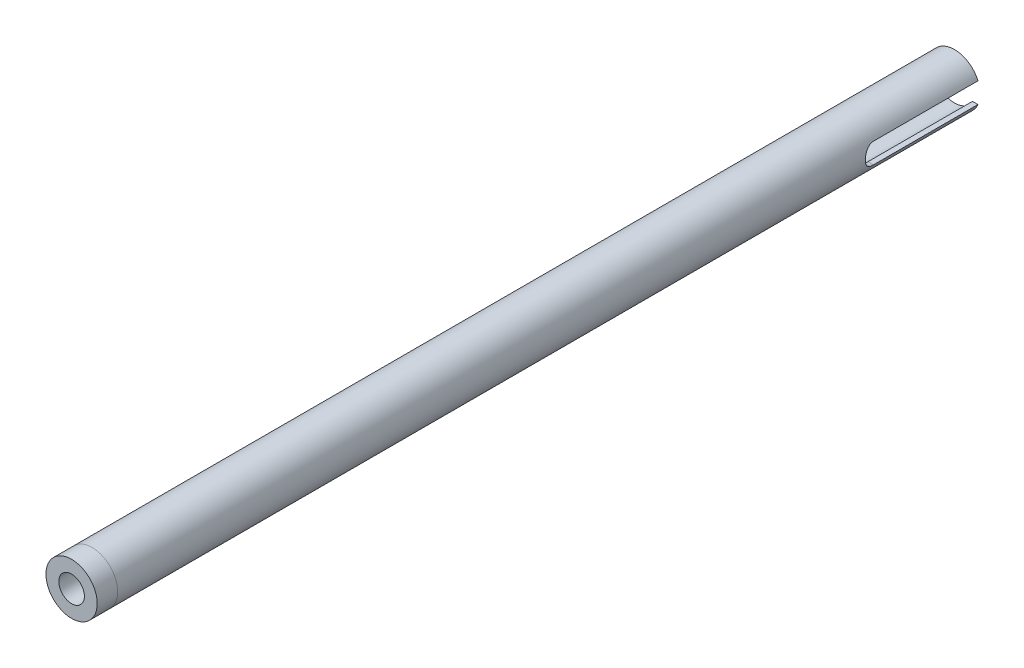
ISO-10303-21;
HEADER;
FILE_DESCRIPTION(('STEP AP214'),'2;1');
FILE_NAME('part.step','',(''),(''),'','','');
FILE_SCHEMA(('AUTOMOTIVE_DESIGN { 1 0 10303 214 1 1 1 1 }'));
ENDSEC;
DATA;
#1=APPLICATION_CONTEXT('core data for automotive mechanical design processes');
#2=APPLICATION_PROTOCOL_DEFINITION('international standard','automotive_design',2000,#1);
#3=PRODUCT_CONTEXT('',#1,'mechanical');
#4=PRODUCT('Part','Part','',(#3));
#5=PRODUCT_RELATED_PRODUCT_CATEGORY('part','',(#4));
#6=PRODUCT_DEFINITION_FORMATION('','',#4);
#7=PRODUCT_DEFINITION_CONTEXT('part definition',#1,'design');
#8=PRODUCT_DEFINITION('design','',#6,#7);
#9=PRODUCT_DEFINITION_SHAPE('','',#8);
#10=(LENGTH_UNIT() NAMED_UNIT(*) SI_UNIT(.MILLI.,.METRE.));
#11=(NAMED_UNIT(*) PLANE_ANGLE_UNIT() SI_UNIT($,.RADIAN.));
#12=(NAMED_UNIT(*) SI_UNIT($,.STERADIAN.) SOLID_ANGLE_UNIT());
#13=UNCERTAINTY_MEASURE_WITH_UNIT(LENGTH_MEASURE(1.E-05),#10,'distance_accuracy_value','');
#14=(GEOMETRIC_REPRESENTATION_CONTEXT(3) GLOBAL_UNCERTAINTY_ASSIGNED_CONTEXT((#13)) GLOBAL_UNIT_ASSIGNED_CONTEXT((#10,
#11,#12)) REPRESENTATION_CONTEXT('',''));
#15=CARTESIAN_POINT('',(0.,0.,0.));
#16=DIRECTION('',(0.,0.,1.));
#17=DIRECTION('',(1.,0.,0.));
#18=AXIS2_PLACEMENT_3D('',#15,#16,#17);
#19=CARTESIAN_POINT('',(0.,0.,-273.485359932267));
#20=DIRECTION('',(0.,0.,1.));
#21=DIRECTION('',(1.,0.,0.));
#22=AXIS2_PLACEMENT_3D('',#19,#20,#21);
#23=CYLINDRICAL_SURFACE('',#22,7.9375);
#24=CARTESIAN_POINT('',(0.,0.,-6.35));
#25=DIRECTION('',(0.,0.,1.));
#26=DIRECTION('',(1.,0.,0.));
#27=AXIS2_PLACEMENT_3D('',#24,#25,#26);
#28=CIRCLE('',#27,7.9375);
#29=CARTESIAN_POINT('',(7.9375,0.,-6.35));
#30=VERTEX_POINT('',#29);
#31=EDGE_CURVE('E167',#30,#30,#28,.T.);
#32=ORIENTED_EDGE('',*,*,#31,.F.);
#33=EDGE_LOOP('',(#32));
#34=FACE_BOUND('',#33,.T.);
#35=CARTESIAN_POINT('',(-7.2748389157424,3.175,-241.100359932267));
#36=CARTESIAN_POINT('',(-7.27482137043434,3.17501267173453,-241.014939816785));
#37=CARTESIAN_POINT('',(-7.27634297592672,3.17155313247793,-240.929529287222));
#38=CARTESIAN_POINT('',(-7.28233338484875,3.15778866907725,-240.759397282894));
#39=CARTESIAN_POINT('',(-7.28680106535325,3.14748635311323,-240.674675558035));
#40=CARTESIAN_POINT('',(-7.29852916312671,3.12019002880163,-240.506861858226));
#41=CARTESIAN_POINT('',(-7.30577831906487,3.10322299732752,-240.423764713467));
#42=CARTESIAN_POINT('',(-7.32282161153745,3.06278779397034,-240.259453611441));
#43=CARTESIAN_POINT('',(-7.33261590324725,3.03931922568673,-240.178239769328));
#44=CARTESIAN_POINT('',(-7.36535331460444,2.9595292434296,-239.938414946745));
#45=CARTESIAN_POINT('',(-7.3916759567784,2.89376893609236,-239.783290017942));
#46=CARTESIAN_POINT('',(-7.45033259991548,2.73920602658921,-239.48620259123));
#47=CARTESIAN_POINT('',(-7.48267254395243,2.65038060922871,-239.344253316013));
#48=CARTESIAN_POINT('',(-7.55175295441386,2.44684429809695,-239.069532546493));
#49=CARTESIAN_POINT('',(-7.58863404630154,2.33103943595689,-238.937605161981));
#50=CARTESIAN_POINT('',(-7.66147718953598,2.07914562663536,-238.694442278349));
#51=CARTESIAN_POINT('',(-7.69743902899202,1.94305205135847,-238.583211513422));
#52=CARTESIAN_POINT('',(-7.76611692840652,1.64778282664418,-238.380290313926));
#53=CARTESIAN_POINT('',(-7.79864638434713,1.48790317306355,-238.289555902522));
#54=CARTESIAN_POINT('',(-7.85502980346525,1.15369615984562,-238.136698349105));
#55=CARTESIAN_POINT('',(-7.87889360585224,0.979385463602713,-238.074542736487));
#56=CARTESIAN_POINT('',(-7.91022225039827,0.670405323433344,-237.994031092831));
#57=CARTESIAN_POINT('',(-7.92038443902171,0.537888188660429,-237.968353169422));
#58=CARTESIAN_POINT('',(-7.93061686811603,0.337231082382099,-237.94259808634));
#59=CARTESIAN_POINT('',(-7.93319257341971,0.269991647180292,-237.93613998906));
#60=CARTESIAN_POINT('',(-7.93663621925193,0.135173873369592,-237.927518971308));
#61=CARTESIAN_POINT('',(-7.93750363389236,0.067595436817584,-237.92535737349));
#62=CARTESIAN_POINT('',(-7.9375,0.,-237.925359932267));
#63=B_SPLINE_CURVE_WITH_KNOTS('',3,(#35,#36,#37,#38,#39,#40,#41,#42,#43,#44,#45,#46,#47,#48,#49,
#50,#51,#52,#53,#54,#55,#56,#57,#58,#59,#60,#61,#62),.UNSPECIFIED.,.F.,.F.,(4,2,2,2,2,2,2,2,2,2,
2,2,2,4),(0.,0.25616079739664,0.512224013007086,0.767261264672294,1.02231406945474,
1.53142416248601,2.041039780479,2.57679273649399,3.11266809162684,3.66991136029743,
4.22651992730647,4.63134321412667,4.83399375866621,5.03670667834028),.UNSPECIFIED.);
#64=CARTESIAN_POINT('',(-7.2748389157424,3.175,-241.100359932267));
#65=VERTEX_POINT('',#64);
#66=CARTESIAN_POINT('',(-7.9375,0.,-237.925359932267));
#67=VERTEX_POINT('',#66);
#68=EDGE_CURVE('E194',#65,#67,#63,.T.);
#69=ORIENTED_EDGE('',*,*,#68,.T.);
#70=CARTESIAN_POINT('',(-7.9375,0.,-237.925359932267));
#71=CARTESIAN_POINT('',(-7.93751279435796,-0.0856973243893161,-237.925347902098));
#72=CARTESIAN_POINT('',(-7.93611246860092,-0.171386675169289,-237.92882926957));
#73=CARTESIAN_POINT('',(-7.93058107051394,-0.342092796869087,-237.942685364905));
#74=CARTESIAN_POINT('',(-7.92645080745519,-0.427109759557717,-237.953058049888));
#75=CARTESIAN_POINT('',(-7.91557399086504,-0.595570690948318,-237.980555243955));
#76=CARTESIAN_POINT('',(-7.90883664469869,-0.679019123580009,-237.997655995228));
#77=CARTESIAN_POINT('',(-7.89293284658536,-0.844038966454647,-238.038423242702));
#78=CARTESIAN_POINT('',(-7.88376629739099,-0.925610301410308,-238.062090001758));
#79=CARTESIAN_POINT('',(-7.8529700783248,-1.16656173687589,-238.142597657457));
#80=CARTESIAN_POINT('',(-7.82802544143957,-1.32244720282991,-238.208990290334));
#81=CARTESIAN_POINT('',(-7.77174407779742,-1.6208190257289,-238.365035694327));
#82=CARTESIAN_POINT('',(-7.74040257287306,-1.76329524966532,-238.45470586639));
#83=CARTESIAN_POINT('',(-7.67287736621953,-2.03755465224645,-238.659159473905));
#84=CARTESIAN_POINT('',(-7.63654472176442,-2.16862853615059,-238.774846330637));
#85=CARTESIAN_POINT('',(-7.56380976030912,-2.41011022612819,-239.026140432346));
#86=CARTESIAN_POINT('',(-7.52740741976911,-2.52050895891189,-239.161756376828));
#87=CARTESIAN_POINT('',(-7.45683282624283,-2.72240939900243,-239.456454871695));
#88=CARTESIAN_POINT('',(-7.4228346735038,-2.81283701743191,-239.61631886161));
#89=CARTESIAN_POINT('',(-7.36333622196319,-2.96511894168389,-239.950444826406));
#90=CARTESIAN_POINT('',(-7.33782422493328,-3.02701262758154,-240.124686564166));
#91=CARTESIAN_POINT('',(-7.30424985403508,-3.10695047193343,-240.432990288817));
#92=CARTESIAN_POINT('',(-7.29331360019112,-3.13238569878911,-240.564849049703));
#93=CARTESIAN_POINT('',(-7.2822797767429,-3.15790858319002,-240.764565931397));
#94=CARTESIAN_POINT('',(-7.27949685702346,-3.16431127275807,-240.831514222157));
#95=CARTESIAN_POINT('',(-7.27577355567174,-3.17285909036155,-240.965755780023));
#96=CARTESIAN_POINT('',(-7.27483380475762,-3.1750027609968,-241.033049157321));
#97=CARTESIAN_POINT('',(-7.2748389157424,-3.175,-241.100359932267));
#98=B_SPLINE_CURVE_WITH_KNOTS('',3,(#70,#71,#72,#73,#74,#75,#76,#77,#78,#79,#80,#81,#82,#83,#84,
#85,#86,#87,#88,#89,#90,#91,#92,#93,#94,#95,#96,#97),.UNSPECIFIED.,.F.,.F.,(4,2,2,2,2,2,2,2,2,2,
2,2,2,4),(0.,0.256996432008006,0.513916713336977,0.769937797705395,1.02596913282158,
1.53722547809955,2.04886511530061,2.58219314099272,3.115754672018,3.67332953074262,
4.23013255190376,4.63306130520188,4.83485003827449,5.03670780985621),.UNSPECIFIED.);
#99=CARTESIAN_POINT('',(-7.2748389157424,-3.175,-241.100359932267));
#100=VERTEX_POINT('',#99);
#101=EDGE_CURVE('E146',#67,#100,#98,.T.);
#102=ORIENTED_EDGE('',*,*,#101,.T.);
#103=DIRECTION('',(0.,0.,-1.));
#104=VECTOR('',#103,1.);
#105=CARTESIAN_POINT('',(-7.2748389157424,-3.175,-237.925359932267));
#106=LINE('',#105,#104);
#107=CARTESIAN_POINT('',(-7.2748389157424,-3.175,-273.485359932267));
#108=VERTEX_POINT('',#107);
#109=EDGE_CURVE('E141',#100,#108,#106,.T.);
#110=ORIENTED_EDGE('',*,*,#109,.T.);
#111=CARTESIAN_POINT('',(0.,0.,-273.485359932267));
#112=DIRECTION('',(0.,0.,1.));
#113=DIRECTION('',(1.,0.,0.));
#114=AXIS2_PLACEMENT_3D('',#111,#112,#113);
#115=CIRCLE('',#114,7.9375);
#116=CARTESIAN_POINT('',(7.2748389157424,-3.175,-273.485359932267));
#117=VERTEX_POINT('',#116);
#118=EDGE_CURVE('E144',#108,#117,#115,.T.);
#119=ORIENTED_EDGE('',*,*,#118,.T.);
#120=DIRECTION('',(0.,0.,-1.));
#121=VECTOR('',#120,1.);
#122=CARTESIAN_POINT('',(7.2748389157424,-3.175,-237.925359932267));
#123=LINE('',#122,#121);
#124=CARTESIAN_POINT('',(7.2748389157424,-3.175,-241.100359932267));
#125=VERTEX_POINT('',#124);
#126=EDGE_CURVE('E427',#125,#117,#123,.T.);
#127=ORIENTED_EDGE('',*,*,#126,.F.);
#128=CARTESIAN_POINT('',(7.2748389157424,-3.175,-241.100359932267));
#129=CARTESIAN_POINT('',(7.27482137043434,-3.17501267173453,-241.014939816785));
#130=CARTESIAN_POINT('',(7.27634297592672,-3.17155313247793,-240.929529287222));
#131=CARTESIAN_POINT('',(7.28233338484875,-3.15778866907725,-240.759397282894));
#132=CARTESIAN_POINT('',(7.28680106535325,-3.14748635311323,-240.674675558035));
#133=CARTESIAN_POINT('',(7.29852916312671,-3.12019002880163,-240.506861858226));
#134=CARTESIAN_POINT('',(7.30577831906487,-3.10322299732752,-240.423764713467));
#135=CARTESIAN_POINT('',(7.32282161153745,-3.06278779397034,-240.259453611441));
#136=CARTESIAN_POINT('',(7.33261590324725,-3.03931922568673,-240.178239769328));
#137=CARTESIAN_POINT('',(7.36535331460444,-2.9595292434296,-239.938414946745));
#138=CARTESIAN_POINT('',(7.3916759567784,-2.89376893609236,-239.783290017942));
#139=CARTESIAN_POINT('',(7.45033259991548,-2.73920602658921,-239.48620259123));
#140=CARTESIAN_POINT('',(7.48267254395243,-2.65038060922871,-239.344253316013));
#141=CARTESIAN_POINT('',(7.55175295441386,-2.44684429809695,-239.069532546493));
#142=CARTESIAN_POINT('',(7.58863404630154,-2.33103943595689,-238.937605161981));
#143=CARTESIAN_POINT('',(7.66147718953598,-2.07914562663536,-238.694442278349));
#144=CARTESIAN_POINT('',(7.69743902899202,-1.94305205135847,-238.583211513422));
#145=CARTESIAN_POINT('',(7.76611692840652,-1.64778282664418,-238.380290313926));
#146=CARTESIAN_POINT('',(7.79864638434713,-1.48790317306355,-238.289555902522));
#147=CARTESIAN_POINT('',(7.85502980346525,-1.15369615984562,-238.136698349105));
#148=CARTESIAN_POINT('',(7.87889360585224,-0.979385463602713,-238.074542736487));
#149=CARTESIAN_POINT('',(7.91022225039827,-0.670405323433344,-237.994031092831));
#150=CARTESIAN_POINT('',(7.92038443902171,-0.537888188660429,-237.968353169422));
#151=CARTESIAN_POINT('',(7.93061686811603,-0.337231082382099,-237.94259808634));
#152=CARTESIAN_POINT('',(7.93319257341971,-0.269991647180292,-237.93613998906));
#153=CARTESIAN_POINT('',(7.93663621925193,-0.135173873369592,-237.927518971308));
#154=CARTESIAN_POINT('',(7.93750363389236,-0.067595436817584,-237.92535737349));
#155=CARTESIAN_POINT('',(7.9375,0.,-237.925359932267));
#156=B_SPLINE_CURVE_WITH_KNOTS('',3,(#128,#129,#130,#131,#132,#133,#134,#135,#136,#137,#138,
#139,#140,#141,#142,#143,#144,#145,#146,#147,#148,#149,#150,#151,#152,#153,#154,#155),
.UNSPECIFIED.,.F.,.F.,(4,2,2,2,2,2,2,2,2,2,2,2,2,4),(0.,0.25616079739664,0.512224013007086,
0.767261264672294,1.02231406945474,1.53142416248601,2.041039780479,2.57679273649399,
3.11266809162684,3.66991136029743,4.22651992730647,4.63134321412667,4.83399375866621,
5.03670667834028),.UNSPECIFIED.);
#157=CARTESIAN_POINT('',(7.9375,0.,-237.925359932267));
#158=VERTEX_POINT('',#157);
#159=EDGE_CURVE('E87',#125,#158,#156,.T.);
#160=ORIENTED_EDGE('',*,*,#159,.T.);
#161=CARTESIAN_POINT('',(7.9375,0.,-237.925359932267));
#162=CARTESIAN_POINT('',(7.93751279435796,0.0856973243893161,-237.925347902098));
#163=CARTESIAN_POINT('',(7.93611246860092,0.171386675169289,-237.92882926957));
#164=CARTESIAN_POINT('',(7.93058107051394,0.342092796869087,-237.942685364905));
#165=CARTESIAN_POINT('',(7.92645080745519,0.427109759557717,-237.953058049888));
#166=CARTESIAN_POINT('',(7.91557399086504,0.595570690948318,-237.980555243955));
#167=CARTESIAN_POINT('',(7.90883664469869,0.679019123580009,-237.997655995228));
#168=CARTESIAN_POINT('',(7.89293284658536,0.844038966454647,-238.038423242702));
#169=CARTESIAN_POINT('',(7.88376629739099,0.925610301410308,-238.062090001758));
#170=CARTESIAN_POINT('',(7.8529700783248,1.16656173687589,-238.142597657457));
#171=CARTESIAN_POINT('',(7.82802544143957,1.32244720282991,-238.208990290334));
#172=CARTESIAN_POINT('',(7.77174407779742,1.6208190257289,-238.365035694327));
#173=CARTESIAN_POINT('',(7.74040257287306,1.76329524966532,-238.45470586639));
#174=CARTESIAN_POINT('',(7.67287736621953,2.03755465224645,-238.659159473905));
#175=CARTESIAN_POINT('',(7.63654472176442,2.16862853615059,-238.774846330637));
#176=CARTESIAN_POINT('',(7.56380976030912,2.41011022612819,-239.026140432346));
#177=CARTESIAN_POINT('',(7.52740741976911,2.52050895891189,-239.161756376828));
#178=CARTESIAN_POINT('',(7.45683282624283,2.72240939900243,-239.456454871695));
#179=CARTESIAN_POINT('',(7.4228346735038,2.81283701743191,-239.61631886161));
#180=CARTESIAN_POINT('',(7.36333622196319,2.96511894168389,-239.950444826406));
#181=CARTESIAN_POINT('',(7.33782422493328,3.02701262758154,-240.124686564166));
#182=CARTESIAN_POINT('',(7.30424985403508,3.10695047193343,-240.432990288817));
#183=CARTESIAN_POINT('',(7.29331360019112,3.13238569878911,-240.564849049703));
#184=CARTESIAN_POINT('',(7.2822797767429,3.15790858319002,-240.764565931397));
#185=CARTESIAN_POINT('',(7.27949685702346,3.16431127275807,-240.831514222157));
#186=CARTESIAN_POINT('',(7.27577355567174,3.17285909036155,-240.965755780023));
#187=CARTESIAN_POINT('',(7.27483380475762,3.1750027609968,-241.033049157321));
#188=CARTESIAN_POINT('',(7.2748389157424,3.175,-241.100359932267));
#189=B_SPLINE_CURVE_WITH_KNOTS('',3,(#161,#162,#163,#164,#165,#166,#167,#168,#169,#170,#171,
#172,#173,#174,#175,#176,#177,#178,#179,#180,#181,#182,#183,#184,#185,#186,#187,#188),
.UNSPECIFIED.,.F.,.F.,(4,2,2,2,2,2,2,2,2,2,2,2,2,4),(0.,0.256996432008006,0.513916713336977,
0.769937797705395,1.02596913282158,1.53722547809955,2.04886511530061,2.58219314099272,
3.115754672018,3.67332953074262,4.23013255190376,4.63306130520188,4.83485003827449,
5.03670780985621),.UNSPECIFIED.);
#190=CARTESIAN_POINT('',(7.2748389157424,3.175,-241.100359932267));
#191=VERTEX_POINT('',#190);
#192=EDGE_CURVE('E73',#158,#191,#189,.T.);
#193=ORIENTED_EDGE('',*,*,#192,.T.);
#194=DIRECTION('',(0.,0.,-1.));
#195=VECTOR('',#194,1.);
#196=CARTESIAN_POINT('',(7.2748389157424,3.175,-237.925359932267));
#197=LINE('',#196,#195);
#198=CARTESIAN_POINT('',(7.2748389157424,3.175,-273.485359932267));
#199=VERTEX_POINT('',#198);
#200=EDGE_CURVE('E160',#191,#199,#197,.T.);
#201=ORIENTED_EDGE('',*,*,#200,.T.);
#202=CARTESIAN_POINT('',(-7.2748389157424,3.175,-273.485359932267));
#203=VERTEX_POINT('',#202);
#204=EDGE_CURVE('E166',#199,#203,#115,.T.);
#205=ORIENTED_EDGE('',*,*,#204,.T.);
#206=DIRECTION('',(0.,0.,-1.));
#207=VECTOR('',#206,1.);
#208=CARTESIAN_POINT('',(-7.2748389157424,3.175,-237.925359932267));
#209=LINE('',#208,#207);
#210=EDGE_CURVE('E420',#65,#203,#209,.T.);
#211=ORIENTED_EDGE('',*,*,#210,.F.);
#212=EDGE_LOOP('',(#69,#102,#110,#119,#127,#160,#193,#201,#205,#211));
#213=FACE_BOUND('',#212,.T.);
#214=ADVANCED_FACE('F63',(#34,#213),#23,.T.);
#215=CARTESIAN_POINT('',(0.,0.,-273.485359932267));
#216=DIRECTION('',(0.,0.,1.));
#217=DIRECTION('',(1.,0.,0.));
#218=AXIS2_PLACEMENT_3D('',#215,#216,#217);
#219=PLANE('',#218);
#220=DIRECTION('',(1.,0.,0.));
#221=VECTOR('',#220,1.);
#222=CARTESIAN_POINT('',(0.,-3.175,-273.485359932267));
#223=LINE('',#222,#221);
#224=CARTESIAN_POINT('',(-5.57246419907746,-3.175,-273.485359932267));
#225=VERTEX_POINT('',#224);
#226=EDGE_CURVE('E153',#108,#225,#223,.T.);
#227=ORIENTED_EDGE('',*,*,#226,.T.);
#228=CARTESIAN_POINT('',(0.,0.,-273.485359932267));
#229=DIRECTION('',(0.,0.,1.));
#230=DIRECTION('',(1.,0.,0.));
#231=AXIS2_PLACEMENT_3D('',#228,#229,#230);
#232=CIRCLE('',#231,6.4135);
#233=CARTESIAN_POINT('',(5.57246419907746,-3.175,-273.485359932267));
#234=VERTEX_POINT('',#233);
#235=EDGE_CURVE('E275',#225,#234,#232,.T.);
#236=ORIENTED_EDGE('',*,*,#235,.T.);
#237=DIRECTION('',(1.,0.,0.));
#238=VECTOR('',#237,1.);
#239=CARTESIAN_POINT('',(0.,-3.175,-273.485359932267));
#240=LINE('',#239,#238);
#241=EDGE_CURVE('E165',#234,#117,#240,.T.);
#242=ORIENTED_EDGE('',*,*,#241,.T.);
#243=ORIENTED_EDGE('',*,*,#118,.F.);
#244=EDGE_LOOP('',(#227,#236,#242,#243));
#245=FACE_BOUND('',#244,.T.);
#246=ADVANCED_FACE('F163',(#245),#219,.F.);
#247=CARTESIAN_POINT('',(0.,0.,-273.485359932267));
#248=DIRECTION('',(0.,0.,1.));
#249=DIRECTION('',(1.,0.,0.));
#250=AXIS2_PLACEMENT_3D('',#247,#248,#249);
#251=CYLINDRICAL_SURFACE('',#250,6.4135);
#252=CARTESIAN_POINT('',(0.,0.,-6.35));
#253=DIRECTION('',(0.,0.,1.));
#254=DIRECTION('',(1.,0.,0.));
#255=AXIS2_PLACEMENT_3D('',#252,#253,#254);
#256=CIRCLE('',#255,6.4135);
#257=CARTESIAN_POINT('',(6.4135,0.,-6.35));
#258=VERTEX_POINT('',#257);
#259=EDGE_CURVE('E149',#258,#258,#256,.T.);
#260=ORIENTED_EDGE('',*,*,#259,.T.);
#261=EDGE_LOOP('',(#260));
#262=FACE_BOUND('',#261,.T.);
#263=DIRECTION('',(0.,0.,-1.));
#264=VECTOR('',#263,1.);
#265=CARTESIAN_POINT('',(-5.57246419907746,-3.175,-237.925359932267));
#266=LINE('',#265,#264);
#267=CARTESIAN_POINT('',(-5.57246419907746,-3.175,-241.100359932267));
#268=VERTEX_POINT('',#267);
#269=EDGE_CURVE('E150',#268,#225,#266,.T.);
#270=ORIENTED_EDGE('',*,*,#269,.F.);
#271=CARTESIAN_POINT('',(-5.57246419907746,-3.175,-241.100359932267));
#272=CARTESIAN_POINT('',(-5.57244013006406,-3.17501485930532,-241.017080819229));
#273=CARTESIAN_POINT('',(-5.57433046393328,-3.17172393593587,-240.933815052358));
#274=CARTESIAN_POINT('',(-5.58175879139227,-3.1586474174694,-240.768007467546));
#275=CARTESIAN_POINT('',(-5.58729459414878,-3.14886572313218,-240.685465244945));
#276=CARTESIAN_POINT('',(-5.60179156831921,-3.12299843383606,-240.522168438216));
#277=CARTESIAN_POINT('',(-5.61073298145,-3.10694918790095,-240.441406333302));
#278=CARTESIAN_POINT('',(-5.63171276239417,-3.068756659135,-240.281762417801));
#279=CARTESIAN_POINT('',(-5.64375147558632,-3.04661269666536,-240.202880817981));
#280=CARTESIAN_POINT('',(-5.6838799338154,-2.97148657354666,-239.970147642983));
#281=CARTESIAN_POINT('',(-5.71602843451585,-2.9097324304215,-239.819727145744));
#282=CARTESIAN_POINT('',(-5.78746445334563,-2.76491119647658,-239.531269928916));
#283=CARTESIAN_POINT('',(-5.82676307252431,-2.68181088046088,-239.39325297155));
#284=CARTESIAN_POINT('',(-5.91189137020973,-2.48887418737119,-239.121455887522));
#285=CARTESIAN_POINT('',(-5.95799203211626,-2.37743022169017,-238.98889908507));
#286=CARTESIAN_POINT('',(-6.04933625068999,-2.13433179626949,-238.743431415997));
#287=CARTESIAN_POINT('',(-6.09457954365872,-2.00267122837296,-238.630526508985));
#288=CARTESIAN_POINT('',(-6.18270630442022,-1.71220053093682,-238.420207216532));
#289=CARTESIAN_POINT('',(-6.22523407848511,-1.55216870534976,-238.324317466101));
#290=CARTESIAN_POINT('',(-6.29953728626817,-1.21586879246633,-238.161468569784));
#291=CARTESIAN_POINT('',(-6.33132906884324,-1.03962591706377,-238.094465391741));
#292=CARTESIAN_POINT('',(-6.37455801221378,-0.71941894247625,-238.004593559411));
#293=CARTESIAN_POINT('',(-6.38903678436651,-0.577736145507954,-237.975020845046));
#294=CARTESIAN_POINT('',(-6.40364692368403,-0.362616983152033,-237.945299770732));
#295=CARTESIAN_POINT('',(-6.40733246196224,-0.290370591494073,-237.937832258094));
#296=CARTESIAN_POINT('',(-6.41226237468065,-0.145424356491902,-237.927859369156));
#297=CARTESIAN_POINT('',(-6.41350576158006,-0.0727243416303689,-237.925356000219));
#298=CARTESIAN_POINT('',(-6.4135,0.,-237.925359932267));
#299=B_SPLINE_CURVE_WITH_KNOTS('',3,(#271,#272,#273,#274,#275,#276,#277,#278,#279,#280,#281,
#282,#283,#284,#285,#286,#287,#288,#289,#290,#291,#292,#293,#294,#295,#296,#297,#298),
.UNSPECIFIED.,.F.,.F.,(4,2,2,2,2,2,2,2,2,2,2,2,2,4),(0.,0.249729002226581,0.499308060527553,
0.74746066754666,0.995640957972498,1.49055300136661,1.98624009021396,2.52160227908799,
3.05712653941521,3.62817923327588,4.19835836008503,4.63305000595098,4.85103401853339,
5.06910615989469),.UNSPECIFIED.);
#300=CARTESIAN_POINT('',(-6.4135,0.,-237.925359932267));
#301=VERTEX_POINT('',#300);
#302=EDGE_CURVE('E221',#268,#301,#299,.T.);
#303=ORIENTED_EDGE('',*,*,#302,.T.);
#304=CARTESIAN_POINT('',(-6.4135,0.,-237.925359932267));
#305=CARTESIAN_POINT('',(-6.41351478956106,0.0839162873638164,-237.925346532371));
#306=CARTESIAN_POINT('',(-6.41185341043851,0.167823114288179,-237.928686458418));
#307=CARTESIAN_POINT('',(-6.40528923860734,0.334952536326369,-237.941968899023));
#308=CARTESIAN_POINT('',(-6.40038773102953,0.418175389480092,-237.951908795844));
#309=CARTESIAN_POINT('',(-6.38748331817869,0.582965498785221,-237.978227600362));
#310=CARTESIAN_POINT('',(-6.37949454331383,0.664538541389254,-237.99457717585));
#311=CARTESIAN_POINT('',(-6.36062930478242,0.825821595252371,-238.033515479443));
#312=CARTESIAN_POINT('',(-6.34975266552956,0.905531492908815,-238.056104586924));
#313=CARTESIAN_POINT('',(-6.31319792977547,1.14087800407252,-238.132841149684));
#314=CARTESIAN_POINT('',(-6.28356695572382,1.29306927815056,-238.196012797872));
#315=CARTESIAN_POINT('',(-6.216480326228,1.58455945770356,-238.344163539852));
#316=CARTESIAN_POINT('',(-6.17901685649498,1.72384528592311,-238.429164431631));
#317=CARTESIAN_POINT('',(-6.09713913910646,1.99475482128858,-238.624264569883));
#318=CARTESIAN_POINT('',(-6.05244508581476,2.12544046453043,-238.735549446621));
#319=CARTESIAN_POINT('',(-5.96206469267669,2.3671627718888,-238.977518892786));
#320=CARTESIAN_POINT('',(-5.9163776032387,2.47818397002904,-239.108218584626));
#321=CARTESIAN_POINT('',(-5.82517699615971,2.68591268931948,-239.397264413578));
#322=CARTESIAN_POINT('',(-5.77994318763785,2.78087960507694,-239.556959608158));
#323=CARTESIAN_POINT('',(-5.69959190124919,2.94207442790849,-239.89234288534));
#324=CARTESIAN_POINT('',(-5.66445328320705,3.00836254036258,-240.067996518512));
#325=CARTESIAN_POINT('',(-5.61637168534323,3.09697219420915,-240.386447892905));
#326=CARTESIAN_POINT('',(-5.60011055849822,3.1260622343607,-240.526862495565));
#327=CARTESIAN_POINT('',(-5.58363385282995,3.15533369889112,-240.740239373807));
#328=CARTESIAN_POINT('',(-5.57946041232981,3.16269716900745,-240.811971098689));
#329=CARTESIAN_POINT('',(-5.57386984218861,3.17253394278506,-240.955913038732));
#330=CARTESIAN_POINT('',(-5.57245416126573,3.17500467618403,-241.028123485403));
#331=CARTESIAN_POINT('',(-5.57246419907746,3.175,-241.100359932267));
#332=B_SPLINE_CURVE_WITH_KNOTS('',3,(#304,#305,#306,#307,#308,#309,#310,#311,#312,#313,#314,
#315,#316,#317,#318,#319,#320,#321,#322,#323,#324,#325,#326,#327,#328,#329,#330,#331),
.UNSPECIFIED.,.F.,.F.,(4,2,2,2,2,2,2,2,2,2,2,2,2,4),(0.,0.251650249697327,0.503200747298844,
0.753613280993145,1.00404104361823,1.50387930503277,2.00421864304454,2.53410176460238,
3.06439980342594,3.63519589642624,4.20478783377489,4.63602373673191,4.85251353275901,
5.06911702550462),.UNSPECIFIED.);
#333=CARTESIAN_POINT('',(-5.57246419907746,3.175,-241.100359932267));
#334=VERTEX_POINT('',#333);
#335=EDGE_CURVE('E186',#301,#334,#332,.T.);
#336=ORIENTED_EDGE('',*,*,#335,.T.);
#337=DIRECTION('',(0.,0.,-1.));
#338=VECTOR('',#337,1.);
#339=CARTESIAN_POINT('',(-5.57246419907746,3.175,-237.925359932267));
#340=LINE('',#339,#338);
#341=CARTESIAN_POINT('',(-5.57246419907746,3.175,-273.485359932267));
#342=VERTEX_POINT('',#341);
#343=EDGE_CURVE('E417',#334,#342,#340,.T.);
#344=ORIENTED_EDGE('',*,*,#343,.T.);
#345=CARTESIAN_POINT('',(5.57246419907746,3.175,-273.485359932267));
#346=VERTEX_POINT('',#345);
#347=EDGE_CURVE('E172',#346,#342,#232,.T.);
#348=ORIENTED_EDGE('',*,*,#347,.F.);
#349=DIRECTION('',(0.,0.,-1.));
#350=VECTOR('',#349,1.);
#351=CARTESIAN_POINT('',(5.57246419907746,3.175,-237.925359932267));
#352=LINE('',#351,#350);
#353=CARTESIAN_POINT('',(5.57246419907746,3.175,-241.100359932267));
#354=VERTEX_POINT('',#353);
#355=EDGE_CURVE('E269',#354,#346,#352,.T.);
#356=ORIENTED_EDGE('',*,*,#355,.F.);
#357=CARTESIAN_POINT('',(5.57246419907746,3.175,-241.100359932267));
#358=CARTESIAN_POINT('',(5.57244013006406,3.17501485930532,-241.017080819229));
#359=CARTESIAN_POINT('',(5.57433046393328,3.17172393593587,-240.933815052358));
#360=CARTESIAN_POINT('',(5.58175879139227,3.1586474174694,-240.768007467546));
#361=CARTESIAN_POINT('',(5.58729459414878,3.14886572313218,-240.685465244945));
#362=CARTESIAN_POINT('',(5.60179156831921,3.12299843383606,-240.522168438216));
#363=CARTESIAN_POINT('',(5.61073298145,3.10694918790095,-240.441406333302));
#364=CARTESIAN_POINT('',(5.63171276239417,3.068756659135,-240.281762417801));
#365=CARTESIAN_POINT('',(5.64375147558632,3.04661269666536,-240.202880817981));
#366=CARTESIAN_POINT('',(5.6838799338154,2.97148657354666,-239.970147642983));
#367=CARTESIAN_POINT('',(5.71602843451585,2.9097324304215,-239.819727145744));
#368=CARTESIAN_POINT('',(5.78746445334563,2.76491119647658,-239.531269928916));
#369=CARTESIAN_POINT('',(5.82676307252431,2.68181088046088,-239.39325297155));
#370=CARTESIAN_POINT('',(5.91189137020973,2.48887418737119,-239.121455887522));
#371=CARTESIAN_POINT('',(5.95799203211626,2.37743022169017,-238.98889908507));
#372=CARTESIAN_POINT('',(6.04933625068999,2.13433179626949,-238.743431415997));
#373=CARTESIAN_POINT('',(6.09457954365872,2.00267122837296,-238.630526508985));
#374=CARTESIAN_POINT('',(6.18270630442022,1.71220053093682,-238.420207216532));
#375=CARTESIAN_POINT('',(6.22523407848511,1.55216870534976,-238.324317466101));
#376=CARTESIAN_POINT('',(6.29953728626817,1.21586879246633,-238.161468569784));
#377=CARTESIAN_POINT('',(6.33132906884324,1.03962591706377,-238.094465391741));
#378=CARTESIAN_POINT('',(6.37455801221378,0.71941894247625,-238.004593559411));
#379=CARTESIAN_POINT('',(6.38903678436651,0.577736145507954,-237.975020845046));
#380=CARTESIAN_POINT('',(6.40364692368403,0.362616983152033,-237.945299770732));
#381=CARTESIAN_POINT('',(6.40733246196224,0.290370591494073,-237.937832258094));
#382=CARTESIAN_POINT('',(6.41226237468065,0.145424356491902,-237.927859369156));
#383=CARTESIAN_POINT('',(6.41350576158006,0.0727243416303689,-237.925356000219));
#384=CARTESIAN_POINT('',(6.4135,0.,-237.925359932267));
#385=B_SPLINE_CURVE_WITH_KNOTS('',3,(#357,#358,#359,#360,#361,#362,#363,#364,#365,#366,#367,
#368,#369,#370,#371,#372,#373,#374,#375,#376,#377,#378,#379,#380,#381,#382,#383,#384),
.UNSPECIFIED.,.F.,.F.,(4,2,2,2,2,2,2,2,2,2,2,2,2,4),(0.,0.249729002226581,0.499308060527553,
0.74746066754666,0.995640957972498,1.49055300136661,1.98624009021396,2.52160227908799,
3.05712653941521,3.62817923327588,4.19835836008503,4.63305000595098,4.85103401853339,
5.06910615989469),.UNSPECIFIED.);
#386=CARTESIAN_POINT('',(6.4135,0.,-237.925359932267));
#387=VERTEX_POINT('',#386);
#388=EDGE_CURVE('E13',#354,#387,#385,.T.);
#389=ORIENTED_EDGE('',*,*,#388,.T.);
#390=CARTESIAN_POINT('',(6.4135,0.,-237.925359932267));
#391=CARTESIAN_POINT('',(6.41351478956106,-0.0839162873638164,-237.925346532371));
#392=CARTESIAN_POINT('',(6.41185341043851,-0.167823114288179,-237.928686458418));
#393=CARTESIAN_POINT('',(6.40528923860734,-0.334952536326369,-237.941968899023));
#394=CARTESIAN_POINT('',(6.40038773102953,-0.418175389480092,-237.951908795844));
#395=CARTESIAN_POINT('',(6.38748331817869,-0.582965498785221,-237.978227600362));
#396=CARTESIAN_POINT('',(6.37949454331383,-0.664538541389254,-237.99457717585));
#397=CARTESIAN_POINT('',(6.36062930478242,-0.825821595252371,-238.033515479443));
#398=CARTESIAN_POINT('',(6.34975266552956,-0.905531492908815,-238.056104586924));
#399=CARTESIAN_POINT('',(6.31319792977547,-1.14087800407252,-238.132841149684));
#400=CARTESIAN_POINT('',(6.28356695572382,-1.29306927815056,-238.196012797872));
#401=CARTESIAN_POINT('',(6.216480326228,-1.58455945770356,-238.344163539852));
#402=CARTESIAN_POINT('',(6.17901685649498,-1.72384528592311,-238.429164431631));
#403=CARTESIAN_POINT('',(6.09713913910646,-1.99475482128858,-238.624264569883));
#404=CARTESIAN_POINT('',(6.05244508581476,-2.12544046453043,-238.735549446621));
#405=CARTESIAN_POINT('',(5.96206469267669,-2.3671627718888,-238.977518892786));
#406=CARTESIAN_POINT('',(5.9163776032387,-2.47818397002904,-239.108218584626));
#407=CARTESIAN_POINT('',(5.82517699615971,-2.68591268931948,-239.397264413578));
#408=CARTESIAN_POINT('',(5.77994318763785,-2.78087960507694,-239.556959608158));
#409=CARTESIAN_POINT('',(5.69959190124919,-2.94207442790849,-239.89234288534));
#410=CARTESIAN_POINT('',(5.66445328320705,-3.00836254036258,-240.067996518512));
#411=CARTESIAN_POINT('',(5.61637168534323,-3.09697219420915,-240.386447892905));
#412=CARTESIAN_POINT('',(5.60011055849822,-3.1260622343607,-240.526862495565));
#413=CARTESIAN_POINT('',(5.58363385282995,-3.15533369889112,-240.740239373807));
#414=CARTESIAN_POINT('',(5.57946041232981,-3.16269716900745,-240.811971098689));
#415=CARTESIAN_POINT('',(5.57386984218861,-3.17253394278506,-240.955913038732));
#416=CARTESIAN_POINT('',(5.57245416126573,-3.17500467618403,-241.028123485403));
#417=CARTESIAN_POINT('',(5.57246419907746,-3.175,-241.100359932267));
#418=B_SPLINE_CURVE_WITH_KNOTS('',3,(#390,#391,#392,#393,#394,#395,#396,#397,#398,#399,#400,
#401,#402,#403,#404,#405,#406,#407,#408,#409,#410,#411,#412,#413,#414,#415,#416,#417),
.UNSPECIFIED.,.F.,.F.,(4,2,2,2,2,2,2,2,2,2,2,2,2,4),(0.,0.251650249697327,0.503200747298844,
0.753613280993145,1.00404104361823,1.50387930503277,2.00421864304454,2.53410176460238,
3.06439980342594,3.63519589642624,4.20478783377489,4.63602373673191,4.85251353275901,
5.06911702550462),.UNSPECIFIED.);
#419=CARTESIAN_POINT('',(5.57246419907746,-3.175,-241.100359932267));
#420=VERTEX_POINT('',#419);
#421=EDGE_CURVE('E237',#387,#420,#418,.T.);
#422=ORIENTED_EDGE('',*,*,#421,.T.);
#423=DIRECTION('',(0.,0.,-1.));
#424=VECTOR('',#423,1.);
#425=CARTESIAN_POINT('',(5.57246419907746,-3.175,-237.925359932267));
#426=LINE('',#425,#424);
#427=EDGE_CURVE('E271',#420,#234,#426,.T.);
#428=ORIENTED_EDGE('',*,*,#427,.T.);
#429=ORIENTED_EDGE('',*,*,#235,.F.);
#430=EDGE_LOOP('',(#270,#303,#336,#344,#348,#356,#389,#422,#428,#429));
#431=FACE_BOUND('',#430,.T.);
#432=ADVANCED_FACE('F201',(#262,#431),#251,.F.);
#433=ORIENTED_EDGE('',*,*,#347,.T.);
#434=DIRECTION('',(1.,0.,0.));
#435=VECTOR('',#434,1.);
#436=CARTESIAN_POINT('',(0.,3.175,-273.485359932267));
#437=LINE('',#436,#435);
#438=EDGE_CURVE('E159',#203,#342,#437,.T.);
#439=ORIENTED_EDGE('',*,*,#438,.F.);
#440=ORIENTED_EDGE('',*,*,#204,.F.);
#441=DIRECTION('',(1.,0.,0.));
#442=VECTOR('',#441,1.);
#443=CARTESIAN_POINT('',(0.,3.175,-273.485359932267));
#444=LINE('',#443,#442);
#445=EDGE_CURVE('E253',#346,#199,#444,.T.);
#446=ORIENTED_EDGE('',*,*,#445,.F.);
#447=EDGE_LOOP('',(#433,#439,#440,#446));
#448=FACE_BOUND('',#447,.T.);
#449=ADVANCED_FACE('F286',(#448),#219,.F.);
#450=CARTESIAN_POINT('',(0.,0.,-6.35));
#451=DIRECTION('',(0.,0.,1.));
#452=DIRECTION('',(1.,0.,0.));
#453=AXIS2_PLACEMENT_3D('',#450,#451,#452);
#454=PLANE('',#453);
#455=ORIENTED_EDGE('',*,*,#259,.F.);
#456=EDGE_LOOP('',(#455));
#457=FACE_BOUND('',#456,.T.);
#458=ORIENTED_EDGE('',*,*,#31,.T.);
#459=EDGE_LOOP('',(#458));
#460=FACE_BOUND('',#459,.T.);
#461=ADVANCED_FACE('F283',(#457,#460),#454,.T.);
#462=CARTESIAN_POINT('',(0.,3.175,-237.925359932267));
#463=DIRECTION('',(0.,1.,0.));
#464=DIRECTION('',(0.,0.,1.));
#465=AXIS2_PLACEMENT_3D('',#462,#463,#464);
#466=PLANE('',#465);
#467=ORIENTED_EDGE('',*,*,#200,.F.);
#468=DIRECTION('',(1.,0.,0.));
#469=VECTOR('',#468,1.);
#470=CARTESIAN_POINT('',(5.57246419907746,3.175,-241.100359932267));
#471=LINE('',#470,#469);
#472=EDGE_CURVE('E184',#191,#354,#471,.F.);
#473=ORIENTED_EDGE('',*,*,#472,.T.);
#474=ORIENTED_EDGE('',*,*,#355,.T.);
#475=ORIENTED_EDGE('',*,*,#445,.T.);
#476=EDGE_LOOP('',(#467,#473,#474,#475));
#477=FACE_BOUND('',#476,.T.);
#478=ADVANCED_FACE('F266',(#477),#466,.F.);
#479=CARTESIAN_POINT('',(0.,-3.175,-237.925359932267));
#480=DIRECTION('',(0.,1.,0.));
#481=DIRECTION('',(0.,0.,1.));
#482=AXIS2_PLACEMENT_3D('',#479,#480,#481);
#483=PLANE('',#482);
#484=ORIENTED_EDGE('',*,*,#427,.F.);
#485=DIRECTION('',(1.,0.,0.));
#486=VECTOR('',#485,1.);
#487=CARTESIAN_POINT('',(0.,-3.175,-241.100359932267));
#488=LINE('',#487,#486);
#489=EDGE_CURVE('E181',#420,#125,#488,.T.);
#490=ORIENTED_EDGE('',*,*,#489,.T.);
#491=ORIENTED_EDGE('',*,*,#126,.T.);
#492=ORIENTED_EDGE('',*,*,#241,.F.);
#493=EDGE_LOOP('',(#484,#490,#491,#492));
#494=FACE_BOUND('',#493,.T.);
#495=ADVANCED_FACE('F361',(#494),#483,.T.);
#496=CARTESIAN_POINT('',(0.,-3.175,-237.925359932267));
#497=DIRECTION('',(0.,1.,0.));
#498=DIRECTION('',(0.,0.,1.));
#499=AXIS2_PLACEMENT_3D('',#496,#497,#498);
#500=PLANE('',#499);
#501=ORIENTED_EDGE('',*,*,#109,.F.);
#502=DIRECTION('',(1.,0.,0.));
#503=VECTOR('',#502,1.);
#504=CARTESIAN_POINT('',(0.,-3.175,-241.100359932267));
#505=LINE('',#504,#503);
#506=EDGE_CURVE('E179',#100,#268,#505,.T.);
#507=ORIENTED_EDGE('',*,*,#506,.T.);
#508=ORIENTED_EDGE('',*,*,#269,.T.);
#509=ORIENTED_EDGE('',*,*,#226,.F.);
#510=EDGE_LOOP('',(#501,#507,#508,#509));
#511=FACE_BOUND('',#510,.T.);
#512=ADVANCED_FACE('F154',(#511),#500,.T.);
#513=CARTESIAN_POINT('',(0.,3.175,-237.925359932267));
#514=DIRECTION('',(0.,1.,0.));
#515=DIRECTION('',(0.,0.,1.));
#516=AXIS2_PLACEMENT_3D('',#513,#514,#515);
#517=PLANE('',#516);
#518=ORIENTED_EDGE('',*,*,#343,.F.);
#519=DIRECTION('',(1.,0.,0.));
#520=VECTOR('',#519,1.);
#521=CARTESIAN_POINT('',(-7.2748389157424,3.175,-241.100359932267));
#522=LINE('',#521,#520);
#523=EDGE_CURVE('E170',#334,#65,#522,.F.);
#524=ORIENTED_EDGE('',*,*,#523,.T.);
#525=ORIENTED_EDGE('',*,*,#210,.T.);
#526=ORIENTED_EDGE('',*,*,#438,.T.);
#527=EDGE_LOOP('',(#518,#524,#525,#526));
#528=FACE_BOUND('',#527,.T.);
#529=ADVANCED_FACE('F216',(#528),#517,.F.);
#530=CARTESIAN_POINT('',(0.,0.,-241.100359932267));
#531=DIRECTION('',(1.,0.,0.));
#532=DIRECTION('',(0.,0.,-1.));
#533=AXIS2_PLACEMENT_3D('',#530,#531,#532);
#534=CYLINDRICAL_SURFACE('',#533,3.175);
#535=ORIENTED_EDGE('',*,*,#506,.F.);
#536=ORIENTED_EDGE('',*,*,#101,.F.);
#537=DIRECTION('',(1.,0.,0.));
#538=VECTOR('',#537,1.);
#539=CARTESIAN_POINT('',(0.,0.,-237.925359932267));
#540=LINE('',#539,#538);
#541=EDGE_CURVE('E251',#301,#67,#540,.F.);
#542=ORIENTED_EDGE('',*,*,#541,.F.);
#543=ORIENTED_EDGE('',*,*,#302,.F.);
#544=EDGE_LOOP('',(#535,#536,#542,#543));
#545=FACE_BOUND('',#544,.T.);
#546=ADVANCED_FACE('F209',(#545),#534,.F.);
#547=CARTESIAN_POINT('',(0.,0.,-241.100359932267));
#548=DIRECTION('',(-1.,0.,0.));
#549=DIRECTION('',(0.,0.,1.));
#550=AXIS2_PLACEMENT_3D('',#547,#548,#549);
#551=CYLINDRICAL_SURFACE('',#550,3.175);
#552=ORIENTED_EDGE('',*,*,#68,.F.);
#553=ORIENTED_EDGE('',*,*,#523,.F.);
#554=ORIENTED_EDGE('',*,*,#335,.F.);
#555=ORIENTED_EDGE('',*,*,#541,.T.);
#556=EDGE_LOOP('',(#552,#553,#554,#555));
#557=FACE_BOUND('',#556,.T.);
#558=ADVANCED_FACE('F205',(#557),#551,.F.);
#559=CARTESIAN_POINT('',(0.,0.,-241.100359932267));
#560=DIRECTION('',(-1.,0.,0.));
#561=DIRECTION('',(0.,0.,1.));
#562=AXIS2_PLACEMENT_3D('',#559,#560,#561);
#563=CYLINDRICAL_SURFACE('',#562,3.175);
#564=DIRECTION('',(1.,0.,0.));
#565=VECTOR('',#564,1.);
#566=CARTESIAN_POINT('',(7.2748389157424,0.,-237.925359932267));
#567=LINE('',#566,#565);
#568=EDGE_CURVE('E68',#387,#158,#567,.T.);
#569=ORIENTED_EDGE('',*,*,#568,.F.);
#570=ORIENTED_EDGE('',*,*,#388,.F.);
#571=ORIENTED_EDGE('',*,*,#472,.F.);
#572=ORIENTED_EDGE('',*,*,#192,.F.);
#573=EDGE_LOOP('',(#569,#570,#571,#572));
#574=FACE_BOUND('',#573,.T.);
#575=ADVANCED_FACE('F65',(#574),#563,.F.);
#576=CARTESIAN_POINT('',(0.,0.,-241.100359932267));
#577=DIRECTION('',(1.,0.,0.));
#578=DIRECTION('',(0.,0.,-1.));
#579=AXIS2_PLACEMENT_3D('',#576,#577,#578);
#580=CYLINDRICAL_SURFACE('',#579,3.175);
#581=ORIENTED_EDGE('',*,*,#421,.F.);
#582=ORIENTED_EDGE('',*,*,#568,.T.);
#583=ORIENTED_EDGE('',*,*,#159,.F.);
#584=ORIENTED_EDGE('',*,*,#489,.F.);
#585=EDGE_LOOP('',(#581,#582,#583,#584));
#586=FACE_BOUND('',#585,.T.);
#587=ADVANCED_FACE('F218',(#586),#580,.F.);
#588=CLOSED_SHELL('',(#214,#246,#432,#449,#461,#478,#495,#512,#529,#546,#558,#575,#587));
#589=MANIFOLD_SOLID_BREP('B2',#588);
#590=CARTESIAN_POINT('',(0.,0.,-6.35));
#591=DIRECTION('',(0.,0.,1.));
#592=DIRECTION('',(1.,0.,0.));
#593=AXIS2_PLACEMENT_3D('',#590,#591,#592);
#594=CYLINDRICAL_SURFACE('',#593,7.9375);
#595=CARTESIAN_POINT('',(0.,0.,-6.35));
#596=DIRECTION('',(0.,0.,1.));
#597=DIRECTION('',(1.,0.,0.));
#598=AXIS2_PLACEMENT_3D('',#595,#596,#597);
#599=CIRCLE('',#598,7.9375);
#600=CARTESIAN_POINT('',(7.9375,0.,-6.35));
#601=VERTEX_POINT('',#600);
#602=EDGE_CURVE('E62',#601,#601,#599,.T.);
#603=ORIENTED_EDGE('',*,*,#602,.T.);
#604=EDGE_LOOP('',(#603));
#605=FACE_BOUND('',#604,.T.);
#606=CARTESIAN_POINT('',(0.,0.,0.));
#607=DIRECTION('',(0.,0.,1.));
#608=DIRECTION('',(1.,0.,0.));
#609=AXIS2_PLACEMENT_3D('',#606,#607,#608);
#610=CIRCLE('',#609,7.9375);
#611=CARTESIAN_POINT('',(7.9375,0.,0.));
#612=VERTEX_POINT('',#611);
#613=EDGE_CURVE('E465',#612,#612,#610,.T.);
#614=ORIENTED_EDGE('',*,*,#613,.F.);
#615=EDGE_LOOP('',(#614));
#616=FACE_BOUND('',#615,.T.);
#617=ADVANCED_FACE('F454',(#605,#616),#594,.T.);
#618=CARTESIAN_POINT('',(0.,0.,-6.35));
#619=DIRECTION('',(0.,0.,1.));
#620=DIRECTION('',(1.,0.,0.));
#621=AXIS2_PLACEMENT_3D('',#618,#619,#620);
#622=CYLINDRICAL_SURFACE('',#621,3.96875);
#623=CARTESIAN_POINT('',(0.,0.,0.));
#624=DIRECTION('',(0.,0.,1.));
#625=DIRECTION('',(1.,0.,0.));
#626=AXIS2_PLACEMENT_3D('',#623,#624,#625);
#627=CIRCLE('',#626,3.96875);
#628=CARTESIAN_POINT('',(3.96875,0.,0.));
#629=VERTEX_POINT('',#628);
#630=EDGE_CURVE('E457',#629,#629,#627,.T.);
#631=ORIENTED_EDGE('',*,*,#630,.T.);
#632=EDGE_LOOP('',(#631));
#633=FACE_BOUND('',#632,.T.);
#634=CARTESIAN_POINT('',(0.,0.,-15.875));
#635=DIRECTION('',(0.,0.,1.));
#636=DIRECTION('',(1.,0.,0.));
#637=AXIS2_PLACEMENT_3D('',#634,#635,#636);
#638=CIRCLE('',#637,3.96875);
#639=CARTESIAN_POINT('',(3.96875,0.,-15.875));
#640=VERTEX_POINT('',#639);
#641=EDGE_CURVE('E477',#640,#640,#638,.T.);
#642=ORIENTED_EDGE('',*,*,#641,.F.);
#643=EDGE_LOOP('',(#642));
#644=FACE_BOUND('',#643,.T.);
#645=ADVANCED_FACE('F485',(#633,#644),#622,.F.);
#646=CARTESIAN_POINT('',(0.,0.,-6.35));
#647=DIRECTION('',(0.,0.,1.));
#648=DIRECTION('',(1.,0.,0.));
#649=AXIS2_PLACEMENT_3D('',#646,#647,#648);
#650=PLANE('',#649);
#651=CARTESIAN_POINT('',(0.,0.,-6.35));
#652=DIRECTION('',(0.,0.,1.));
#653=DIRECTION('',(1.,0.,0.));
#654=AXIS2_PLACEMENT_3D('',#651,#652,#653);
#655=CIRCLE('',#654,6.4135);
#656=CARTESIAN_POINT('',(6.4135,0.,-6.35));
#657=VERTEX_POINT('',#656);
#658=EDGE_CURVE('E467',#657,#657,#655,.T.);
#659=ORIENTED_EDGE('',*,*,#658,.T.);
#660=EDGE_LOOP('',(#659));
#661=FACE_BOUND('',#660,.T.);
#662=ORIENTED_EDGE('',*,*,#602,.F.);
#663=EDGE_LOOP('',(#662));
#664=FACE_BOUND('',#663,.T.);
#665=ADVANCED_FACE('F487',(#661,#664),#650,.F.);
#666=CARTESIAN_POINT('',(0.,0.,0.));
#667=DIRECTION('',(0.,0.,1.));
#668=DIRECTION('',(1.,0.,0.));
#669=AXIS2_PLACEMENT_3D('',#666,#667,#668);
#670=PLANE('',#669);
#671=ORIENTED_EDGE('',*,*,#613,.T.);
#672=EDGE_LOOP('',(#671));
#673=FACE_BOUND('',#672,.T.);
#674=ORIENTED_EDGE('',*,*,#630,.F.);
#675=EDGE_LOOP('',(#674));
#676=FACE_BOUND('',#675,.T.);
#677=ADVANCED_FACE('F493',(#673,#676),#670,.T.);
#678=CARTESIAN_POINT('',(0.,0.,-15.875));
#679=DIRECTION('',(0.,0.,1.));
#680=DIRECTION('',(1.,0.,0.));
#681=AXIS2_PLACEMENT_3D('',#678,#679,#680);
#682=CYLINDRICAL_SURFACE('',#681,6.4135);
#683=CARTESIAN_POINT('',(0.,0.,-15.875));
#684=DIRECTION('',(0.,0.,1.));
#685=DIRECTION('',(1.,0.,0.));
#686=AXIS2_PLACEMENT_3D('',#683,#684,#685);
#687=CIRCLE('',#686,6.4135);
#688=CARTESIAN_POINT('',(6.4135,0.,-15.875));
#689=VERTEX_POINT('',#688);
#690=EDGE_CURVE('E470',#689,#689,#687,.T.);
#691=CARTESIAN_POINT('',(6.4135,0.,-15.875));
#692=CARTESIAN_POINT('',(6.4135,0.,-15.77578125));
#693=CARTESIAN_POINT('',(6.4135,0.,-15.6765625));
#694=CARTESIAN_POINT('',(6.4135,0.,-15.478125));
#695=CARTESIAN_POINT('',(6.4135,0.,-15.37890625));
#696=CARTESIAN_POINT('',(6.4135,0.,-15.18046875));
#697=CARTESIAN_POINT('',(6.4135,0.,-15.08125));
#698=CARTESIAN_POINT('',(6.4135,0.,-14.8828125));
#699=CARTESIAN_POINT('',(6.4135,0.,-14.78359375));
#700=CARTESIAN_POINT('',(6.4135,0.,-14.58515625));
#701=CARTESIAN_POINT('',(6.4135,0.,-14.4859375));
#702=CARTESIAN_POINT('',(6.4135,0.,-14.2875));
#703=CARTESIAN_POINT('',(6.4135,0.,-14.18828125));
#704=CARTESIAN_POINT('',(6.4135,0.,-13.98984375));
#705=CARTESIAN_POINT('',(6.4135,0.,-13.890625));
#706=CARTESIAN_POINT('',(6.4135,0.,-13.6921875));
#707=CARTESIAN_POINT('',(6.4135,0.,-13.59296875));
#708=CARTESIAN_POINT('',(6.4135,0.,-13.39453125));
#709=CARTESIAN_POINT('',(6.4135,0.,-13.2953125));
#710=CARTESIAN_POINT('',(6.4135,0.,-13.096875));
#711=CARTESIAN_POINT('',(6.4135,0.,-12.99765625));
#712=CARTESIAN_POINT('',(6.4135,0.,-12.79921875));
#713=CARTESIAN_POINT('',(6.4135,0.,-12.7));
#714=CARTESIAN_POINT('',(6.4135,0.,-12.5015625));
#715=CARTESIAN_POINT('',(6.4135,0.,-12.40234375));
#716=CARTESIAN_POINT('',(6.4135,0.,-12.20390625));
#717=CARTESIAN_POINT('',(6.4135,0.,-12.1046875));
#718=CARTESIAN_POINT('',(6.4135,0.,-11.90625));
#719=CARTESIAN_POINT('',(6.4135,0.,-11.80703125));
#720=CARTESIAN_POINT('',(6.4135,0.,-11.60859375));
#721=CARTESIAN_POINT('',(6.4135,0.,-11.509375));
#722=CARTESIAN_POINT('',(6.4135,0.,-11.3109375));
#723=CARTESIAN_POINT('',(6.4135,0.,-11.21171875));
#724=CARTESIAN_POINT('',(6.4135,0.,-11.01328125));
#725=CARTESIAN_POINT('',(6.4135,0.,-10.9140625));
#726=CARTESIAN_POINT('',(6.4135,0.,-10.715625));
#727=CARTESIAN_POINT('',(6.4135,0.,-10.61640625));
#728=CARTESIAN_POINT('',(6.4135,0.,-10.41796875));
#729=CARTESIAN_POINT('',(6.4135,0.,-10.31875));
#730=CARTESIAN_POINT('',(6.4135,0.,-10.1203125));
#731=CARTESIAN_POINT('',(6.4135,0.,-10.02109375));
#732=CARTESIAN_POINT('',(6.4135,0.,-9.82265625));
#733=CARTESIAN_POINT('',(6.4135,0.,-9.7234375));
#734=CARTESIAN_POINT('',(6.4135,0.,-9.525));
#735=CARTESIAN_POINT('',(6.4135,0.,-9.42578125));
#736=CARTESIAN_POINT('',(6.4135,0.,-9.22734375));
#737=CARTESIAN_POINT('',(6.4135,0.,-9.128125));
#738=CARTESIAN_POINT('',(6.4135,0.,-8.9296875));
#739=CARTESIAN_POINT('',(6.4135,0.,-8.83046875));
#740=CARTESIAN_POINT('',(6.4135,0.,-8.63203125));
#741=CARTESIAN_POINT('',(6.4135,0.,-8.5328125));
#742=CARTESIAN_POINT('',(6.4135,0.,-8.334375));
#743=CARTESIAN_POINT('',(6.4135,0.,-8.23515625));
#744=CARTESIAN_POINT('',(6.4135,0.,-8.03671875));
#745=CARTESIAN_POINT('',(6.4135,0.,-7.9375));
#746=CARTESIAN_POINT('',(6.4135,0.,-7.7390625));
#747=CARTESIAN_POINT('',(6.4135,0.,-7.63984375));
#748=CARTESIAN_POINT('',(6.4135,0.,-7.44140625));
#749=CARTESIAN_POINT('',(6.4135,0.,-7.3421875));
#750=CARTESIAN_POINT('',(6.4135,0.,-7.14375));
#751=CARTESIAN_POINT('',(6.4135,0.,-7.04453125));
#752=CARTESIAN_POINT('',(6.4135,0.,-6.84609375));
#753=CARTESIAN_POINT('',(6.4135,0.,-6.746875));
#754=CARTESIAN_POINT('',(6.4135,0.,-6.5484375));
#755=CARTESIAN_POINT('',(6.4135,0.,-6.44921875));
#756=CARTESIAN_POINT('',(6.4135,0.,-6.35));
#757=B_SPLINE_CURVE_WITH_KNOTS('',3,(#691,#692,#693,#694,#695,#696,#697,#698,#699,#700,#701,
#702,#703,#704,#705,#706,#707,#708,#709,#710,#711,#712,#713,#714,#715,#716,#717,#718,#719,#720,
#721,#722,#723,#724,#725,#726,#727,#728,#729,#730,#731,#732,#733,#734,#735,#736,#737,#738,#739,
#740,#741,#742,#743,#744,#745,#746,#747,#748,#749,#750,#751,#752,#753,#754,#755,#756),
.UNSPECIFIED.,.F.,.F.,(4,2,2,2,2,2,2,2,2,2,2,2,2,2,2,2,2,2,2,2,2,2,2,2,2,2,2,2,2,2,2,2,4),(0.,
0.297656250000002,0.595312500000002,0.892968750000002,1.190625,1.48828125,1.7859375,2.08359375,
2.38125,2.67890625,2.9765625,3.27421875,3.571875,3.86953125,4.1671875,4.46484375,4.7625,
5.06015625,5.3578125,5.65546875,5.953125,6.25078125,6.5484375,6.84609375,7.14375,7.44140625,
7.7390625,8.03671875,8.334375,8.63203125,8.9296875,9.22734375,9.525),.UNSPECIFIED.);
#758=EDGE_CURVE('BSEAM498',#689,#657,#757,.T.);
#759=ORIENTED_EDGE('',*,*,#690,.T.);
#760=ORIENTED_EDGE('',*,*,#658,.F.);
#761=ORIENTED_EDGE('',*,*,#758,.T.);
#762=ORIENTED_EDGE('',*,*,#758,.F.);
#763=EDGE_LOOP('',(#759,#761,#760,#762));
#764=FACE_BOUND('',#763,.T.);
#765=ADVANCED_FACE('F498',(#764),#682,.T.);
#766=CARTESIAN_POINT('',(0.,0.,-15.875));
#767=DIRECTION('',(0.,0.,1.));
#768=DIRECTION('',(1.,0.,0.));
#769=AXIS2_PLACEMENT_3D('',#766,#767,#768);
#770=PLANE('',#769);
#771=ORIENTED_EDGE('',*,*,#641,.T.);
#772=EDGE_LOOP('',(#771));
#773=FACE_BOUND('',#772,.T.);
#774=ORIENTED_EDGE('',*,*,#690,.F.);
#775=EDGE_LOOP('',(#774));
#776=FACE_BOUND('',#775,.T.);
#777=ADVANCED_FACE('F482',(#773,#776),#770,.F.);
#778=CLOSED_SHELL('',(#617,#645,#665,#677,#765,#777));
#779=MANIFOLD_SOLID_BREP('B7',#778);
#780=ADVANCED_BREP_SHAPE_REPRESENTATION('',(#18,#589,#779),#14);
#781=SHAPE_DEFINITION_REPRESENTATION(#9,#780);
ENDSEC;
END-ISO-10303-21;
